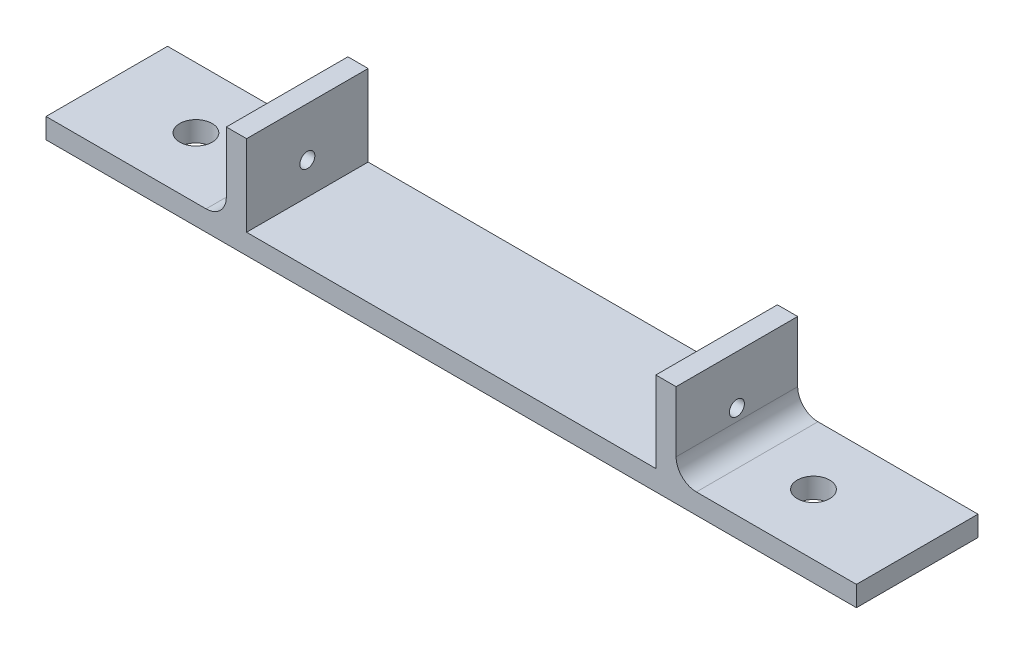
ISO-10303-21;
HEADER;
FILE_DESCRIPTION(('STEP AP214'),'2;1');
FILE_NAME('part.step','',(''),(''),'','','');
FILE_SCHEMA(('AUTOMOTIVE_DESIGN { 1 0 10303 214 1 1 1 1 }'));
ENDSEC;
DATA;
#1=APPLICATION_CONTEXT('core data for automotive mechanical design processes');
#2=APPLICATION_PROTOCOL_DEFINITION('international standard','automotive_design',2000,#1);
#3=PRODUCT_CONTEXT('',#1,'mechanical');
#4=PRODUCT('Part','Part','',(#3));
#5=PRODUCT_RELATED_PRODUCT_CATEGORY('part','',(#4));
#6=PRODUCT_DEFINITION_FORMATION('','',#4);
#7=PRODUCT_DEFINITION_CONTEXT('part definition',#1,'design');
#8=PRODUCT_DEFINITION('design','',#6,#7);
#9=PRODUCT_DEFINITION_SHAPE('','',#8);
#10=(LENGTH_UNIT() NAMED_UNIT(*) SI_UNIT(.MILLI.,.METRE.));
#11=(NAMED_UNIT(*) PLANE_ANGLE_UNIT() SI_UNIT($,.RADIAN.));
#12=(NAMED_UNIT(*) SI_UNIT($,.STERADIAN.) SOLID_ANGLE_UNIT());
#13=UNCERTAINTY_MEASURE_WITH_UNIT(LENGTH_MEASURE(1.E-05),#10,'distance_accuracy_value','');
#14=(GEOMETRIC_REPRESENTATION_CONTEXT(3) GLOBAL_UNCERTAINTY_ASSIGNED_CONTEXT((#13)) GLOBAL_UNIT_ASSIGNED_CONTEXT((#10,
#11,#12)) REPRESENTATION_CONTEXT('',''));
#15=CARTESIAN_POINT('',(0.,0.,0.));
#16=DIRECTION('',(0.,0.,1.));
#17=DIRECTION('',(1.,0.,0.));
#18=AXIS2_PLACEMENT_3D('',#15,#16,#17);
#19=CARTESIAN_POINT('',(0.,5.,0.));
#20=DIRECTION('',(0.,1.,0.));
#21=DIRECTION('',(0.,0.,1.));
#22=AXIS2_PLACEMENT_3D('',#19,#20,#21);
#23=PLANE('',#22);
#24=DIRECTION('',(1.,0.,0.));
#25=VECTOR('',#24,1.);
#26=CARTESIAN_POINT('',(100.,5.,15.));
#27=LINE('',#26,#25);
#28=CARTESIAN_POINT('',(-50.5,5.,15.));
#29=VERTEX_POINT('',#28);
#30=CARTESIAN_POINT('',(50.5,5.,15.));
#31=VERTEX_POINT('',#30);
#32=EDGE_CURVE('E160',#29,#31,#27,.T.);
#33=ORIENTED_EDGE('',*,*,#32,.T.);
#34=DIRECTION('',(0.,0.,1.));
#35=VECTOR('',#34,1.);
#36=CARTESIAN_POINT('',(50.5,5.,15.));
#37=LINE('',#36,#35);
#38=CARTESIAN_POINT('',(50.5,5.,-15.));
#39=VERTEX_POINT('',#38);
#40=EDGE_CURVE('E158',#39,#31,#37,.T.);
#41=ORIENTED_EDGE('',*,*,#40,.F.);
#42=DIRECTION('',(-1.,0.,0.));
#43=VECTOR('',#42,1.);
#44=CARTESIAN_POINT('',(100.,5.,-15.));
#45=LINE('',#44,#43);
#46=CARTESIAN_POINT('',(-50.5,5.,-15.));
#47=VERTEX_POINT('',#46);
#48=EDGE_CURVE('E142',#39,#47,#45,.T.);
#49=ORIENTED_EDGE('',*,*,#48,.T.);
#50=DIRECTION('',(0.,0.,-1.));
#51=VECTOR('',#50,1.);
#52=CARTESIAN_POINT('',(-50.5,5.,15.));
#53=LINE('',#52,#51);
#54=EDGE_CURVE('E164',#29,#47,#53,.T.);
#55=ORIENTED_EDGE('',*,*,#54,.F.);
#56=EDGE_LOOP('',(#33,#41,#49,#55));
#57=FACE_BOUND('',#56,.T.);
#58=ADVANCED_FACE('F42',(#57),#23,.T.);
#59=CARTESIAN_POINT('',(74.4,5.,0.));
#60=DIRECTION('',(0.,1.,0.));
#61=DIRECTION('',(0.,0.,1.));
#62=AXIS2_PLACEMENT_3D('',#59,#60,#61);
#63=CIRCLE('',#62,4.00000000000001);
#64=CARTESIAN_POINT('',(74.4,5.,4.00000000000001));
#65=VERTEX_POINT('',#64);
#66=EDGE_CURVE('E309',#65,#65,#63,.T.);
#67=ORIENTED_EDGE('',*,*,#66,.F.);
#68=EDGE_LOOP('',(#67));
#69=FACE_BOUND('',#68,.T.);
#70=CARTESIAN_POINT('',(100.,5.,-15.));
#71=VERTEX_POINT('',#70);
#72=CARTESIAN_POINT('',(60.5,5.,-15.));
#73=VERTEX_POINT('',#72);
#74=EDGE_CURVE('E154',#71,#73,#45,.T.);
#75=ORIENTED_EDGE('',*,*,#74,.T.);
#76=DIRECTION('',(0.,0.,-1.));
#77=VECTOR('',#76,1.);
#78=CARTESIAN_POINT('',(60.5,5.,0.));
#79=LINE('',#78,#77);
#80=CARTESIAN_POINT('',(60.5,5.,15.));
#81=VERTEX_POINT('',#80);
#82=EDGE_CURVE('E235',#73,#81,#79,.F.);
#83=ORIENTED_EDGE('',*,*,#82,.T.);
#84=CARTESIAN_POINT('',(100.,5.,15.));
#85=VERTEX_POINT('',#84);
#86=EDGE_CURVE('E206',#81,#85,#27,.T.);
#87=ORIENTED_EDGE('',*,*,#86,.T.);
#88=DIRECTION('',(0.,0.,-1.));
#89=VECTOR('',#88,1.);
#90=CARTESIAN_POINT('',(100.,5.,15.));
#91=LINE('',#90,#89);
#92=EDGE_CURVE('E210',#85,#71,#91,.T.);
#93=ORIENTED_EDGE('',*,*,#92,.T.);
#94=EDGE_LOOP('',(#75,#83,#87,#93));
#95=FACE_BOUND('',#94,.T.);
#96=ADVANCED_FACE('F262',(#69,#95),#23,.T.);
#97=CARTESIAN_POINT('',(-78.,5.,0.));
#98=DIRECTION('',(0.,1.,0.));
#99=DIRECTION('',(0.,0.,1.));
#100=AXIS2_PLACEMENT_3D('',#97,#98,#99);
#101=CIRCLE('',#100,4.00000000000001);
#102=CARTESIAN_POINT('',(-78.,5.,4.00000000000002));
#103=VERTEX_POINT('',#102);
#104=EDGE_CURVE('E303',#103,#103,#101,.T.);
#105=ORIENTED_EDGE('',*,*,#104,.F.);
#106=EDGE_LOOP('',(#105));
#107=FACE_BOUND('',#106,.T.);
#108=CARTESIAN_POINT('',(-100.,5.,15.));
#109=VERTEX_POINT('',#108);
#110=CARTESIAN_POINT('',(-60.5,5.,15.));
#111=VERTEX_POINT('',#110);
#112=EDGE_CURVE('E208',#109,#111,#27,.T.);
#113=ORIENTED_EDGE('',*,*,#112,.T.);
#114=DIRECTION('',(0.,0.,1.));
#115=VECTOR('',#114,1.);
#116=CARTESIAN_POINT('',(-60.5,5.,0.));
#117=LINE('',#116,#115);
#118=CARTESIAN_POINT('',(-60.5,5.,-15.));
#119=VERTEX_POINT('',#118);
#120=EDGE_CURVE('E64',#111,#119,#117,.F.);
#121=ORIENTED_EDGE('',*,*,#120,.T.);
#122=CARTESIAN_POINT('',(-100.,5.,-15.));
#123=VERTEX_POINT('',#122);
#124=EDGE_CURVE('E155',#119,#123,#45,.T.);
#125=ORIENTED_EDGE('',*,*,#124,.T.);
#126=DIRECTION('',(0.,0.,1.));
#127=VECTOR('',#126,1.);
#128=CARTESIAN_POINT('',(-100.,5.,15.));
#129=LINE('',#128,#127);
#130=EDGE_CURVE('E203',#123,#109,#129,.T.);
#131=ORIENTED_EDGE('',*,*,#130,.T.);
#132=EDGE_LOOP('',(#113,#121,#125,#131));
#133=FACE_BOUND('',#132,.T.);
#134=ADVANCED_FACE('F325',(#107,#133),#23,.T.);
#135=CARTESIAN_POINT('',(-100.,5.,15.));
#136=DIRECTION('',(1.,0.,0.));
#137=DIRECTION('',(0.,0.,-1.));
#138=AXIS2_PLACEMENT_3D('',#135,#136,#137);
#139=PLANE('',#138);
#140=DIRECTION('',(0.,0.,1.));
#141=VECTOR('',#140,1.);
#142=CARTESIAN_POINT('',(-100.,0.,15.));
#143=LINE('',#142,#141);
#144=CARTESIAN_POINT('',(-100.,0.,-15.));
#145=VERTEX_POINT('',#144);
#146=CARTESIAN_POINT('',(-100.,0.,15.));
#147=VERTEX_POINT('',#146);
#148=EDGE_CURVE('E202',#145,#147,#143,.T.);
#149=ORIENTED_EDGE('',*,*,#148,.T.);
#150=DIRECTION('',(0.,-1.,0.));
#151=VECTOR('',#150,1.);
#152=CARTESIAN_POINT('',(-100.,5.,15.));
#153=LINE('',#152,#151);
#154=EDGE_CURVE('E229',#109,#147,#153,.T.);
#155=ORIENTED_EDGE('',*,*,#154,.F.);
#156=ORIENTED_EDGE('',*,*,#130,.F.);
#157=DIRECTION('',(0.,-1.,0.));
#158=VECTOR('',#157,1.);
#159=CARTESIAN_POINT('',(-100.,5.,-15.));
#160=LINE('',#159,#158);
#161=EDGE_CURVE('E213',#123,#145,#160,.T.);
#162=ORIENTED_EDGE('',*,*,#161,.T.);
#163=EDGE_LOOP('',(#149,#155,#156,#162));
#164=FACE_BOUND('',#163,.T.);
#165=ADVANCED_FACE('F275',(#164),#139,.F.);
#166=CARTESIAN_POINT('',(100.,5.,15.));
#167=DIRECTION('',(0.,0.,-1.));
#168=DIRECTION('',(-1.,0.,0.));
#169=AXIS2_PLACEMENT_3D('',#166,#167,#168);
#170=PLANE('',#169);
#171=DIRECTION('',(1.,0.,0.));
#172=VECTOR('',#171,1.);
#173=CARTESIAN_POINT('',(100.,0.,15.));
#174=LINE('',#173,#172);
#175=CARTESIAN_POINT('',(100.,0.,15.));
#176=VERTEX_POINT('',#175);
#177=EDGE_CURVE('E216',#147,#176,#174,.T.);
#178=ORIENTED_EDGE('',*,*,#177,.T.);
#179=DIRECTION('',(0.,-1.,0.));
#180=VECTOR('',#179,1.);
#181=CARTESIAN_POINT('',(100.,5.,15.));
#182=LINE('',#181,#180);
#183=EDGE_CURVE('E226',#85,#176,#182,.T.);
#184=ORIENTED_EDGE('',*,*,#183,.F.);
#185=ORIENTED_EDGE('',*,*,#86,.F.);
#186=CARTESIAN_POINT('',(60.5,10.,15.));
#187=DIRECTION('',(0.,0.,-1.));
#188=DIRECTION('',(-1.,0.,0.));
#189=AXIS2_PLACEMENT_3D('',#186,#187,#188);
#190=CIRCLE('',#189,5.);
#191=CARTESIAN_POINT('',(55.5,10.,15.));
#192=VERTEX_POINT('',#191);
#193=EDGE_CURVE('E243',#81,#192,#190,.T.);
#194=ORIENTED_EDGE('',*,*,#193,.T.);
#195=DIRECTION('',(0.,-1.,0.));
#196=VECTOR('',#195,1.);
#197=CARTESIAN_POINT('',(55.5,25.,15.));
#198=LINE('',#197,#196);
#199=CARTESIAN_POINT('',(55.5,25.,15.));
#200=VERTEX_POINT('',#199);
#201=EDGE_CURVE('E175',#200,#192,#198,.T.);
#202=ORIENTED_EDGE('',*,*,#201,.F.);
#203=DIRECTION('',(1.,0.,0.));
#204=VECTOR('',#203,1.);
#205=CARTESIAN_POINT('',(55.5,25.,15.));
#206=LINE('',#205,#204);
#207=CARTESIAN_POINT('',(50.5,25.,15.));
#208=VERTEX_POINT('',#207);
#209=EDGE_CURVE('E180',#208,#200,#206,.T.);
#210=ORIENTED_EDGE('',*,*,#209,.F.);
#211=DIRECTION('',(0.,-1.,0.));
#212=VECTOR('',#211,1.);
#213=CARTESIAN_POINT('',(50.5,25.,15.));
#214=LINE('',#213,#212);
#215=EDGE_CURVE('E258',#208,#31,#214,.T.);
#216=ORIENTED_EDGE('',*,*,#215,.T.);
#217=ORIENTED_EDGE('',*,*,#32,.F.);
#218=DIRECTION('',(0.,-1.,0.));
#219=VECTOR('',#218,1.);
#220=CARTESIAN_POINT('',(-50.5,25.,15.));
#221=LINE('',#220,#219);
#222=CARTESIAN_POINT('',(-50.5,25.,15.));
#223=VERTEX_POINT('',#222);
#224=EDGE_CURVE('E197',#223,#29,#221,.T.);
#225=ORIENTED_EDGE('',*,*,#224,.F.);
#226=DIRECTION('',(1.,0.,0.));
#227=VECTOR('',#226,1.);
#228=CARTESIAN_POINT('',(-50.5,25.,15.));
#229=LINE('',#228,#227);
#230=CARTESIAN_POINT('',(-55.5,25.,15.));
#231=VERTEX_POINT('',#230);
#232=EDGE_CURVE('E186',#231,#223,#229,.T.);
#233=ORIENTED_EDGE('',*,*,#232,.F.);
#234=DIRECTION('',(0.,-1.,0.));
#235=VECTOR('',#234,1.);
#236=CARTESIAN_POINT('',(-55.5,25.,15.));
#237=LINE('',#236,#235);
#238=CARTESIAN_POINT('',(-55.5,10.,15.));
#239=VERTEX_POINT('',#238);
#240=EDGE_CURVE('E200',#231,#239,#237,.T.);
#241=ORIENTED_EDGE('',*,*,#240,.T.);
#242=CARTESIAN_POINT('',(-60.5,10.,15.));
#243=DIRECTION('',(0.,0.,-1.));
#244=DIRECTION('',(-1.,0.,0.));
#245=AXIS2_PLACEMENT_3D('',#242,#243,#244);
#246=CIRCLE('',#245,5.);
#247=EDGE_CURVE('E51',#239,#111,#246,.T.);
#248=ORIENTED_EDGE('',*,*,#247,.T.);
#249=ORIENTED_EDGE('',*,*,#112,.F.);
#250=ORIENTED_EDGE('',*,*,#154,.T.);
#251=EDGE_LOOP('',(#178,#184,#185,#194,#202,#210,#216,#217,#225,#233,#241,#248,#249,#250));
#252=FACE_BOUND('',#251,.T.);
#253=ADVANCED_FACE('F249',(#252),#170,.F.);
#254=CARTESIAN_POINT('',(100.,5.,15.));
#255=DIRECTION('',(-1.,0.,0.));
#256=DIRECTION('',(0.,0.,1.));
#257=AXIS2_PLACEMENT_3D('',#254,#255,#256);
#258=PLANE('',#257);
#259=DIRECTION('',(0.,0.,-1.));
#260=VECTOR('',#259,1.);
#261=CARTESIAN_POINT('',(100.,0.,15.));
#262=LINE('',#261,#260);
#263=CARTESIAN_POINT('',(100.,0.,-15.));
#264=VERTEX_POINT('',#263);
#265=EDGE_CURVE('E218',#176,#264,#262,.T.);
#266=ORIENTED_EDGE('',*,*,#265,.T.);
#267=DIRECTION('',(0.,-1.,0.));
#268=VECTOR('',#267,1.);
#269=CARTESIAN_POINT('',(100.,5.,-15.));
#270=LINE('',#269,#268);
#271=EDGE_CURVE('E223',#71,#264,#270,.T.);
#272=ORIENTED_EDGE('',*,*,#271,.F.);
#273=ORIENTED_EDGE('',*,*,#92,.F.);
#274=ORIENTED_EDGE('',*,*,#183,.T.);
#275=EDGE_LOOP('',(#266,#272,#273,#274));
#276=FACE_BOUND('',#275,.T.);
#277=ADVANCED_FACE('F266',(#276),#258,.F.);
#278=CARTESIAN_POINT('',(100.,5.,-15.));
#279=DIRECTION('',(0.,0.,1.));
#280=DIRECTION('',(1.,0.,0.));
#281=AXIS2_PLACEMENT_3D('',#278,#279,#280);
#282=PLANE('',#281);
#283=DIRECTION('',(-1.,0.,0.));
#284=VECTOR('',#283,1.);
#285=CARTESIAN_POINT('',(100.,0.,-15.));
#286=LINE('',#285,#284);
#287=EDGE_CURVE('E207',#264,#145,#286,.T.);
#288=ORIENTED_EDGE('',*,*,#287,.T.);
#289=ORIENTED_EDGE('',*,*,#161,.F.);
#290=ORIENTED_EDGE('',*,*,#124,.F.);
#291=CARTESIAN_POINT('',(-60.5,10.,-15.));
#292=DIRECTION('',(0.,0.,1.));
#293=DIRECTION('',(1.,0.,0.));
#294=AXIS2_PLACEMENT_3D('',#291,#292,#293);
#295=CIRCLE('',#294,5.);
#296=CARTESIAN_POINT('',(-55.5,10.,-15.));
#297=VERTEX_POINT('',#296);
#298=EDGE_CURVE('E11',#119,#297,#295,.T.);
#299=ORIENTED_EDGE('',*,*,#298,.T.);
#300=DIRECTION('',(0.,-1.,0.));
#301=VECTOR('',#300,1.);
#302=CARTESIAN_POINT('',(-55.5,25.,-15.));
#303=LINE('',#302,#301);
#304=CARTESIAN_POINT('',(-55.5,25.,-15.));
#305=VERTEX_POINT('',#304);
#306=EDGE_CURVE('E192',#305,#297,#303,.T.);
#307=ORIENTED_EDGE('',*,*,#306,.F.);
#308=DIRECTION('',(-1.,0.,0.));
#309=VECTOR('',#308,1.);
#310=CARTESIAN_POINT('',(-50.5,25.,-15.));
#311=LINE('',#310,#309);
#312=CARTESIAN_POINT('',(-50.5,25.,-15.));
#313=VERTEX_POINT('',#312);
#314=EDGE_CURVE('E190',#313,#305,#311,.T.);
#315=ORIENTED_EDGE('',*,*,#314,.F.);
#316=DIRECTION('',(0.,-1.,0.));
#317=VECTOR('',#316,1.);
#318=CARTESIAN_POINT('',(-50.5,25.,-15.));
#319=LINE('',#318,#317);
#320=EDGE_CURVE('E151',#313,#47,#319,.T.);
#321=ORIENTED_EDGE('',*,*,#320,.T.);
#322=ORIENTED_EDGE('',*,*,#48,.F.);
#323=DIRECTION('',(0.,-1.,0.));
#324=VECTOR('',#323,1.);
#325=CARTESIAN_POINT('',(50.5,25.,-15.));
#326=LINE('',#325,#324);
#327=CARTESIAN_POINT('',(50.5,25.,-15.));
#328=VERTEX_POINT('',#327);
#329=EDGE_CURVE('E147',#328,#39,#326,.T.);
#330=ORIENTED_EDGE('',*,*,#329,.F.);
#331=DIRECTION('',(-1.,0.,0.));
#332=VECTOR('',#331,1.);
#333=CARTESIAN_POINT('',(55.5,25.,-15.));
#334=LINE('',#333,#332);
#335=CARTESIAN_POINT('',(55.5,25.,-15.));
#336=VERTEX_POINT('',#335);
#337=EDGE_CURVE('E169',#336,#328,#334,.T.);
#338=ORIENTED_EDGE('',*,*,#337,.F.);
#339=DIRECTION('',(0.,-1.,0.));
#340=VECTOR('',#339,1.);
#341=CARTESIAN_POINT('',(55.5,25.,-15.));
#342=LINE('',#341,#340);
#343=CARTESIAN_POINT('',(55.5,10.,-15.));
#344=VERTEX_POINT('',#343);
#345=EDGE_CURVE('E170',#336,#344,#342,.T.);
#346=ORIENTED_EDGE('',*,*,#345,.T.);
#347=CARTESIAN_POINT('',(60.5,10.,-15.));
#348=DIRECTION('',(0.,0.,1.));
#349=DIRECTION('',(1.,0.,0.));
#350=AXIS2_PLACEMENT_3D('',#347,#348,#349);
#351=CIRCLE('',#350,5.);
#352=EDGE_CURVE('E241',#344,#73,#351,.T.);
#353=ORIENTED_EDGE('',*,*,#352,.T.);
#354=ORIENTED_EDGE('',*,*,#74,.F.);
#355=ORIENTED_EDGE('',*,*,#271,.T.);
#356=EDGE_LOOP('',(#288,#289,#290,#299,#307,#315,#321,#322,#330,#338,#346,#353,#354,#355));
#357=FACE_BOUND('',#356,.T.);
#358=ADVANCED_FACE('F144',(#357),#282,.F.);
#359=CARTESIAN_POINT('',(0.,0.,0.));
#360=DIRECTION('',(0.,1.,0.));
#361=DIRECTION('',(0.,0.,1.));
#362=AXIS2_PLACEMENT_3D('',#359,#360,#361);
#363=PLANE('',#362);
#364=CARTESIAN_POINT('',(74.4,0.,0.));
#365=DIRECTION('',(0.,1.,0.));
#366=DIRECTION('',(0.,0.,1.));
#367=AXIS2_PLACEMENT_3D('',#364,#365,#366);
#368=CIRCLE('',#367,4.00000000000001);
#369=CARTESIAN_POINT('',(74.4,0.,4.00000000000001));
#370=VERTEX_POINT('',#369);
#371=EDGE_CURVE('E306',#370,#370,#368,.T.);
#372=ORIENTED_EDGE('',*,*,#371,.T.);
#373=EDGE_LOOP('',(#372));
#374=FACE_BOUND('',#373,.T.);
#375=CARTESIAN_POINT('',(-78.,0.,0.));
#376=DIRECTION('',(0.,1.,0.));
#377=DIRECTION('',(0.,0.,1.));
#378=AXIS2_PLACEMENT_3D('',#375,#376,#377);
#379=CIRCLE('',#378,4.00000000000001);
#380=CARTESIAN_POINT('',(-78.,0.,4.00000000000002));
#381=VERTEX_POINT('',#380);
#382=EDGE_CURVE('E302',#381,#381,#379,.T.);
#383=ORIENTED_EDGE('',*,*,#382,.T.);
#384=EDGE_LOOP('',(#383));
#385=FACE_BOUND('',#384,.T.);
#386=ORIENTED_EDGE('',*,*,#148,.F.);
#387=ORIENTED_EDGE('',*,*,#287,.F.);
#388=ORIENTED_EDGE('',*,*,#265,.F.);
#389=ORIENTED_EDGE('',*,*,#177,.F.);
#390=EDGE_LOOP('',(#386,#387,#388,#389));
#391=FACE_BOUND('',#390,.T.);
#392=ADVANCED_FACE('F272',(#374,#385,#391),#363,.F.);
#393=CARTESIAN_POINT('',(-55.5,25.,15.));
#394=DIRECTION('',(1.,0.,0.));
#395=DIRECTION('',(0.,0.,-1.));
#396=AXIS2_PLACEMENT_3D('',#393,#394,#395);
#397=PLANE('',#396);
#398=CARTESIAN_POINT('',(-55.5,12.94,0.));
#399=DIRECTION('',(-1.,0.,0.));
#400=DIRECTION('',(0.,0.,1.));
#401=AXIS2_PLACEMENT_3D('',#398,#399,#400);
#402=CIRCLE('',#401,1.85);
#403=CARTESIAN_POINT('',(-55.5,12.94,1.85000000000001));
#404=VERTEX_POINT('',#403);
#405=EDGE_CURVE('E299',#404,#404,#402,.T.);
#406=ORIENTED_EDGE('',*,*,#405,.F.);
#407=EDGE_LOOP('',(#406));
#408=FACE_BOUND('',#407,.T.);
#409=ORIENTED_EDGE('',*,*,#306,.T.);
#410=DIRECTION('',(0.,0.,1.));
#411=VECTOR('',#410,1.);
#412=CARTESIAN_POINT('',(-55.5,10.,15.));
#413=LINE('',#412,#411);
#414=EDGE_CURVE('E237',#297,#239,#413,.T.);
#415=ORIENTED_EDGE('',*,*,#414,.T.);
#416=ORIENTED_EDGE('',*,*,#240,.F.);
#417=DIRECTION('',(0.,0.,1.));
#418=VECTOR('',#417,1.);
#419=CARTESIAN_POINT('',(-55.5,25.,15.));
#420=LINE('',#419,#418);
#421=EDGE_CURVE('E183',#305,#231,#420,.T.);
#422=ORIENTED_EDGE('',*,*,#421,.F.);
#423=EDGE_LOOP('',(#409,#415,#416,#422));
#424=FACE_BOUND('',#423,.T.);
#425=ADVANCED_FACE('F283',(#408,#424),#397,.F.);
#426=CARTESIAN_POINT('',(-50.5,25.,15.));
#427=DIRECTION('',(-1.,0.,0.));
#428=DIRECTION('',(0.,0.,1.));
#429=AXIS2_PLACEMENT_3D('',#426,#427,#428);
#430=PLANE('',#429);
#431=CARTESIAN_POINT('',(-50.5,12.94,0.));
#432=DIRECTION('',(-1.,0.,0.));
#433=DIRECTION('',(0.,0.,1.));
#434=AXIS2_PLACEMENT_3D('',#431,#432,#433);
#435=CIRCLE('',#434,1.85);
#436=CARTESIAN_POINT('',(-50.5,12.94,1.85000000000001));
#437=VERTEX_POINT('',#436);
#438=EDGE_CURVE('E291',#437,#437,#435,.T.);
#439=ORIENTED_EDGE('',*,*,#438,.T.);
#440=EDGE_LOOP('',(#439));
#441=FACE_BOUND('',#440,.T.);
#442=ORIENTED_EDGE('',*,*,#54,.T.);
#443=ORIENTED_EDGE('',*,*,#320,.F.);
#444=DIRECTION('',(0.,0.,-1.));
#445=VECTOR('',#444,1.);
#446=CARTESIAN_POINT('',(-50.5,25.,15.));
#447=LINE('',#446,#445);
#448=EDGE_CURVE('E188',#223,#313,#447,.T.);
#449=ORIENTED_EDGE('',*,*,#448,.F.);
#450=ORIENTED_EDGE('',*,*,#224,.T.);
#451=EDGE_LOOP('',(#442,#443,#449,#450));
#452=FACE_BOUND('',#451,.T.);
#453=ADVANCED_FACE('F290',(#441,#452),#430,.F.);
#454=CARTESIAN_POINT('',(0.,25.,0.));
#455=DIRECTION('',(0.,1.,0.));
#456=DIRECTION('',(0.,0.,1.));
#457=AXIS2_PLACEMENT_3D('',#454,#455,#456);
#458=PLANE('',#457);
#459=ORIENTED_EDGE('',*,*,#421,.T.);
#460=ORIENTED_EDGE('',*,*,#232,.T.);
#461=ORIENTED_EDGE('',*,*,#448,.T.);
#462=ORIENTED_EDGE('',*,*,#314,.T.);
#463=EDGE_LOOP('',(#459,#460,#461,#462));
#464=FACE_BOUND('',#463,.T.);
#465=ADVANCED_FACE('F288',(#464),#458,.T.);
#466=CARTESIAN_POINT('',(50.5,25.,15.));
#467=DIRECTION('',(1.,0.,0.));
#468=DIRECTION('',(0.,0.,-1.));
#469=AXIS2_PLACEMENT_3D('',#466,#467,#468);
#470=PLANE('',#469);
#471=CARTESIAN_POINT('',(50.5,12.94,0.));
#472=DIRECTION('',(1.,0.,0.));
#473=DIRECTION('',(0.,0.,-1.));
#474=AXIS2_PLACEMENT_3D('',#471,#472,#473);
#475=CIRCLE('',#474,1.85);
#476=CARTESIAN_POINT('',(50.5,12.94,-1.84999999999999));
#477=VERTEX_POINT('',#476);
#478=EDGE_CURVE('E294',#477,#477,#475,.T.);
#479=ORIENTED_EDGE('',*,*,#478,.T.);
#480=EDGE_LOOP('',(#479));
#481=FACE_BOUND('',#480,.T.);
#482=ORIENTED_EDGE('',*,*,#40,.T.);
#483=ORIENTED_EDGE('',*,*,#215,.F.);
#484=DIRECTION('',(0.,0.,1.));
#485=VECTOR('',#484,1.);
#486=CARTESIAN_POINT('',(50.5,25.,15.));
#487=LINE('',#486,#485);
#488=EDGE_CURVE('E165',#328,#208,#487,.T.);
#489=ORIENTED_EDGE('',*,*,#488,.F.);
#490=ORIENTED_EDGE('',*,*,#329,.T.);
#491=EDGE_LOOP('',(#482,#483,#489,#490));
#492=FACE_BOUND('',#491,.T.);
#493=ADVANCED_FACE('F167',(#481,#492),#470,.F.);
#494=CARTESIAN_POINT('',(55.5,25.,15.));
#495=DIRECTION('',(-1.,0.,0.));
#496=DIRECTION('',(0.,0.,1.));
#497=AXIS2_PLACEMENT_3D('',#494,#495,#496);
#498=PLANE('',#497);
#499=CARTESIAN_POINT('',(55.5,12.94,0.));
#500=DIRECTION('',(-1.,0.,0.));
#501=DIRECTION('',(0.,0.,1.));
#502=AXIS2_PLACEMENT_3D('',#499,#500,#501);
#503=CIRCLE('',#502,1.85);
#504=CARTESIAN_POINT('',(55.5,12.94,1.85000000000001));
#505=VERTEX_POINT('',#504);
#506=EDGE_CURVE('E46',#505,#505,#503,.T.);
#507=ORIENTED_EDGE('',*,*,#506,.T.);
#508=EDGE_LOOP('',(#507));
#509=FACE_BOUND('',#508,.T.);
#510=ORIENTED_EDGE('',*,*,#201,.T.);
#511=DIRECTION('',(0.,0.,-1.));
#512=VECTOR('',#511,1.);
#513=CARTESIAN_POINT('',(55.5,10.,15.));
#514=LINE('',#513,#512);
#515=EDGE_CURVE('E232',#192,#344,#514,.T.);
#516=ORIENTED_EDGE('',*,*,#515,.T.);
#517=ORIENTED_EDGE('',*,*,#345,.F.);
#518=DIRECTION('',(0.,0.,-1.));
#519=VECTOR('',#518,1.);
#520=CARTESIAN_POINT('',(55.5,25.,15.));
#521=LINE('',#520,#519);
#522=EDGE_CURVE('E172',#200,#336,#521,.T.);
#523=ORIENTED_EDGE('',*,*,#522,.F.);
#524=EDGE_LOOP('',(#510,#516,#517,#523));
#525=FACE_BOUND('',#524,.T.);
#526=ADVANCED_FACE('F256',(#509,#525),#498,.F.);
#527=CARTESIAN_POINT('',(0.,25.,0.));
#528=DIRECTION('',(0.,1.,0.));
#529=DIRECTION('',(0.,0.,1.));
#530=AXIS2_PLACEMENT_3D('',#527,#528,#529);
#531=PLANE('',#530);
#532=ORIENTED_EDGE('',*,*,#488,.T.);
#533=ORIENTED_EDGE('',*,*,#209,.T.);
#534=ORIENTED_EDGE('',*,*,#522,.T.);
#535=ORIENTED_EDGE('',*,*,#337,.T.);
#536=EDGE_LOOP('',(#532,#533,#534,#535));
#537=FACE_BOUND('',#536,.T.);
#538=ADVANCED_FACE('F346',(#537),#531,.T.);
#539=CARTESIAN_POINT('',(60.5,10.,15.));
#540=DIRECTION('',(0.,0.,-1.));
#541=DIRECTION('',(-1.,0.,0.));
#542=AXIS2_PLACEMENT_3D('',#539,#540,#541);
#543=CYLINDRICAL_SURFACE('',#542,5.);
#544=ORIENTED_EDGE('',*,*,#193,.F.);
#545=ORIENTED_EDGE('',*,*,#82,.F.);
#546=ORIENTED_EDGE('',*,*,#352,.F.);
#547=ORIENTED_EDGE('',*,*,#515,.F.);
#548=EDGE_LOOP('',(#544,#545,#546,#547));
#549=FACE_BOUND('',#548,.T.);
#550=ADVANCED_FACE('F259',(#549),#543,.F.);
#551=CARTESIAN_POINT('',(-60.5,10.,15.));
#552=DIRECTION('',(0.,0.,1.));
#553=DIRECTION('',(1.,0.,0.));
#554=AXIS2_PLACEMENT_3D('',#551,#552,#553);
#555=CYLINDRICAL_SURFACE('',#554,5.);
#556=ORIENTED_EDGE('',*,*,#298,.F.);
#557=ORIENTED_EDGE('',*,*,#120,.F.);
#558=ORIENTED_EDGE('',*,*,#247,.F.);
#559=ORIENTED_EDGE('',*,*,#414,.F.);
#560=EDGE_LOOP('',(#556,#557,#558,#559));
#561=FACE_BOUND('',#560,.T.);
#562=ADVANCED_FACE('F44',(#561),#555,.F.);
#563=CARTESIAN_POINT('',(100.,12.94,0.));
#564=DIRECTION('',(-1.,0.,0.));
#565=DIRECTION('',(0.,0.,1.));
#566=AXIS2_PLACEMENT_3D('',#563,#564,#565);
#567=CYLINDRICAL_SURFACE('',#566,1.85);
#568=ORIENTED_EDGE('',*,*,#506,.F.);
#569=EDGE_LOOP('',(#568));
#570=FACE_BOUND('',#569,.T.);
#571=ORIENTED_EDGE('',*,*,#478,.F.);
#572=EDGE_LOOP('',(#571));
#573=FACE_BOUND('',#572,.T.);
#574=ADVANCED_FACE('F351',(#570,#573),#567,.F.);
#575=ORIENTED_EDGE('',*,*,#405,.T.);
#576=EDGE_LOOP('',(#575));
#577=FACE_BOUND('',#576,.T.);
#578=ORIENTED_EDGE('',*,*,#438,.F.);
#579=EDGE_LOOP('',(#578));
#580=FACE_BOUND('',#579,.T.);
#581=ADVANCED_FACE('F370',(#577,#580),#567,.F.);
#582=CARTESIAN_POINT('',(-78.,0.,0.));
#583=DIRECTION('',(0.,1.,0.));
#584=DIRECTION('',(0.,0.,1.));
#585=AXIS2_PLACEMENT_3D('',#582,#583,#584);
#586=CYLINDRICAL_SURFACE('',#585,4.00000000000001);
#587=ORIENTED_EDGE('',*,*,#382,.F.);
#588=EDGE_LOOP('',(#587));
#589=FACE_BOUND('',#588,.T.);
#590=ORIENTED_EDGE('',*,*,#104,.T.);
#591=EDGE_LOOP('',(#590));
#592=FACE_BOUND('',#591,.T.);
#593=ADVANCED_FACE('F320',(#589,#592),#586,.F.);
#594=CARTESIAN_POINT('',(74.4,0.,0.));
#595=DIRECTION('',(0.,1.,0.));
#596=DIRECTION('',(0.,0.,1.));
#597=AXIS2_PLACEMENT_3D('',#594,#595,#596);
#598=CYLINDRICAL_SURFACE('',#597,4.00000000000001);
#599=ORIENTED_EDGE('',*,*,#371,.F.);
#600=EDGE_LOOP('',(#599));
#601=FACE_BOUND('',#600,.T.);
#602=ORIENTED_EDGE('',*,*,#66,.T.);
#603=EDGE_LOOP('',(#602));
#604=FACE_BOUND('',#603,.T.);
#605=ADVANCED_FACE('F317',(#601,#604),#598,.F.);
#606=CLOSED_SHELL('',(#58,#96,#134,#165,#253,#277,#358,#392,#425,#453,#465,#493,#526,#538,#550,
#562,#574,#581,#593,#605));
#607=MANIFOLD_SOLID_BREP('B2',#606);
#608=ADVANCED_BREP_SHAPE_REPRESENTATION('',(#18,#607),#14);
#609=SHAPE_DEFINITION_REPRESENTATION(#9,#608);
ENDSEC;
END-ISO-10303-21;
